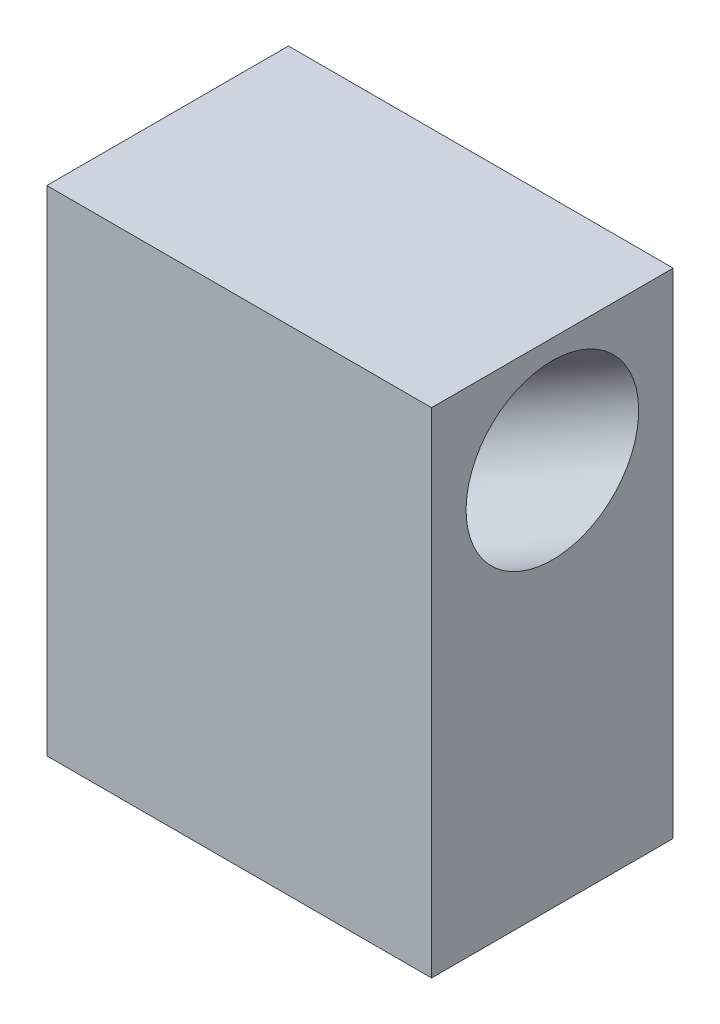
ISO-10303-21;
HEADER;
FILE_DESCRIPTION(('STEP AP214'),'2;1');
FILE_NAME('part.step','',(''),(''),'','','');
FILE_SCHEMA(('AUTOMOTIVE_DESIGN { 1 0 10303 214 1 1 1 1 }'));
ENDSEC;
DATA;
#1=APPLICATION_CONTEXT('core data for automotive mechanical design processes');
#2=APPLICATION_PROTOCOL_DEFINITION('international standard','automotive_design',2000,#1);
#3=PRODUCT_CONTEXT('',#1,'mechanical');
#4=PRODUCT('Part','Part','',(#3));
#5=PRODUCT_RELATED_PRODUCT_CATEGORY('part','',(#4));
#6=PRODUCT_DEFINITION_FORMATION('','',#4);
#7=PRODUCT_DEFINITION_CONTEXT('part definition',#1,'design');
#8=PRODUCT_DEFINITION('design','',#6,#7);
#9=PRODUCT_DEFINITION_SHAPE('','',#8);
#10=(LENGTH_UNIT() NAMED_UNIT(*) SI_UNIT(.MILLI.,.METRE.));
#11=(NAMED_UNIT(*) PLANE_ANGLE_UNIT() SI_UNIT($,.RADIAN.));
#12=(NAMED_UNIT(*) SI_UNIT($,.STERADIAN.) SOLID_ANGLE_UNIT());
#13=UNCERTAINTY_MEASURE_WITH_UNIT(LENGTH_MEASURE(1.E-05),#10,'distance_accuracy_value','');
#14=(GEOMETRIC_REPRESENTATION_CONTEXT(3) GLOBAL_UNCERTAINTY_ASSIGNED_CONTEXT((#13)) GLOBAL_UNIT_ASSIGNED_CONTEXT((#10,
#11,#12)) REPRESENTATION_CONTEXT('',''));
#15=CARTESIAN_POINT('',(0.,0.,0.));
#16=DIRECTION('',(0.,0.,1.));
#17=DIRECTION('',(1.,0.,0.));
#18=AXIS2_PLACEMENT_3D('',#15,#16,#17);
#19=CARTESIAN_POINT('',(0.,38.0812099293112,17.78));
#20=DIRECTION('',(1.,0.,0.));
#21=DIRECTION('',(0.,0.,-1.));
#22=AXIS2_PLACEMENT_3D('',#19,#20,#21);
#23=PLANE('',#22);
#24=CARTESIAN_POINT('',(0.,20.2863265692952,8.89));
#25=CARTESIAN_POINT('',(0.,20.2863260897579,8.69126862023859));
#26=CARTESIAN_POINT('',(0.,20.2769889766129,8.49253326947338));
#27=CARTESIAN_POINT('',(0.,20.2418661010776,8.1195227619519));
#28=CARTESIAN_POINT('',(0.,20.2180887225423,7.94505533322798));
#29=CARTESIAN_POINT('',(0.,20.156119160635,7.59862425830768));
#30=CARTESIAN_POINT('',(0.,20.1179214556568,7.42666159742627));
#31=CARTESIAN_POINT('',(0.,20.0273926884376,7.08656754330484));
#32=CARTESIAN_POINT('',(0.,19.9750668607778,6.91843475603493));
#33=CARTESIAN_POINT('',(0.,19.856615696106,6.58703423157109));
#34=CARTESIAN_POINT('',(0.,19.7904854395179,6.42376825256326));
#35=CARTESIAN_POINT('',(0.,19.6449197726799,6.10335020602728));
#36=CARTESIAN_POINT('',(0.,19.5654891306215,5.94619597222868));
#37=CARTESIAN_POINT('',(0.,19.3938237587573,5.63896943964902));
#38=CARTESIAN_POINT('',(0.,19.301584445833,5.48889970166747));
#39=CARTESIAN_POINT('',(0.,19.1049960764894,5.19699190627981));
#40=CARTESIAN_POINT('',(0.,19.0006513754242,5.05515091566477));
#41=CARTESIAN_POINT('',(0.,18.780506534387,4.78057232664983));
#42=CARTESIAN_POINT('',(0.,18.6647022968242,4.6478380134644));
#43=CARTESIAN_POINT('',(0.,18.4225134517148,4.39249174611572));
#44=CARTESIAN_POINT('',(0.,18.2961326547466,4.2698761776709));
#45=CARTESIAN_POINT('',(0.,18.0335802364329,4.03551879915482));
#46=CARTESIAN_POINT('',(0.,17.8974051176356,3.92378090724803));
#47=CARTESIAN_POINT('',(0.,17.6162956994275,3.71203896919075));
#48=CARTESIAN_POINT('',(0.,17.4713645599103,3.6120307278887));
#49=CARTESIAN_POINT('',(0.,17.1736461170773,3.42435845562458));
#50=CARTESIAN_POINT('',(0.,17.0208560130054,3.33669886763715));
#51=CARTESIAN_POINT('',(0.,16.7085793994891,3.17440139015028));
#52=CARTESIAN_POINT('',(0.,16.5490953120552,3.09975884037798));
#53=CARTESIAN_POINT('',(0.,16.2244223318891,2.96394792736694));
#54=CARTESIAN_POINT('',(0.,16.0592314123553,2.90278440936246));
#55=CARTESIAN_POINT('',(0.,15.7244005860883,2.7944077893921));
#56=CARTESIAN_POINT('',(0.,15.5547622966968,2.74718969056413));
#57=CARTESIAN_POINT('',(0.,15.2120898150925,2.66698594112672));
#58=CARTESIAN_POINT('',(0.,15.0390544260055,2.63400540434465));
#59=CARTESIAN_POINT('',(0.,14.6909040498447,2.5825389846644));
#60=CARTESIAN_POINT('',(0.,14.5157898311002,2.56404790603069));
#61=CARTESIAN_POINT('',(0.,14.1645708104071,2.54166282010777));
#62=CARTESIAN_POINT('',(0.,13.9884656755116,2.5377740538021));
#63=CARTESIAN_POINT('',(0.,13.636592275125,2.54463969373982));
#64=CARTESIAN_POINT('',(0.,13.4608239114469,2.5553888472222));
#65=CARTESIAN_POINT('',(0.,13.1107675938402,2.59143108344181));
#66=CARTESIAN_POINT('',(0.,12.9364801938397,2.61672938432492));
#67=CARTESIAN_POINT('',(0.,12.4177871006445,2.71424054583492));
#68=CARTESIAN_POINT('',(0.,12.0771790115668,2.80807723599546));
#69=CARTESIAN_POINT('',(0.,11.4163733142905,3.05078707683446));
#70=CARTESIAN_POINT('',(0.,11.0961757060919,3.19966022751293));
#71=CARTESIAN_POINT('',(0.,10.4847861121548,3.54835806793774));
#72=CARTESIAN_POINT('',(0.,10.1935941264162,3.74818275768409));
#73=CARTESIAN_POINT('',(0.,9.64831057584094,4.19326655878891));
#74=CARTESIAN_POINT('',(0.,9.39421901100433,4.43852567014738));
#75=CARTESIAN_POINT('',(0.,8.93012752402846,4.96771525734179));
#76=CARTESIAN_POINT('',(0.,8.7201276018892,5.25164573317773));
#77=CARTESIAN_POINT('',(0.,8.35001602999509,5.8503464532956));
#78=CARTESIAN_POINT('',(0.,8.18990438024024,6.16511669757754));
#79=CARTESIAN_POINT('',(0.,7.92398423202495,6.81681527305533));
#80=CARTESIAN_POINT('',(0.,7.8181757335645,7.15374360425119));
#81=CARTESIAN_POINT('',(0.,7.66378055478155,7.84046538324557));
#82=CARTESIAN_POINT('',(0.,7.61519387445905,8.19025883104409));
#83=CARTESIAN_POINT('',(0.,7.57658233741491,8.89306307293928));
#84=CARTESIAN_POINT('',(0.,7.58655748069327,9.24607386703595));
#85=CARTESIAN_POINT('',(0.,7.66479446277027,9.94557628150946));
#86=CARTESIAN_POINT('',(0.,7.7330563015689,10.2920679018863));
#87=CARTESIAN_POINT('',(0.,7.92598400195642,10.9689752629039));
#88=CARTESIAN_POINT('',(0.,8.0506498635453,11.2993910035447));
#89=CARTESIAN_POINT('',(0.,8.35294682984507,11.9350332792569));
#90=CARTESIAN_POINT('',(0.,8.53057793455597,12.2402598143283));
#91=CARTESIAN_POINT('',(0.,8.93390730205747,12.8171051568859));
#92=CARTESIAN_POINT('',(0.,9.15960556484808,13.0887239643721));
#93=CARTESIAN_POINT('',(0.,9.65283962148778,13.5908620856587));
#94=CARTESIAN_POINT('',(0.,9.92037541533687,13.8213813994591));
#95=CARTESIAN_POINT('',(0.,10.4899225610873,14.234963059233));
#96=CARTESIAN_POINT('',(0.,10.7919339129887,14.4180254052065));
#97=CARTESIAN_POINT('',(0.,11.4220387438292,14.7316419252481));
#98=CARTESIAN_POINT('',(0.,11.7501322227684,14.8621960993161));
#99=CARTESIAN_POINT('',(0.,12.4235892074182,15.0672032363122));
#100=CARTESIAN_POINT('',(0.,12.7689527131288,15.1416561992403));
#101=CARTESIAN_POINT('',(0.,13.2923245521952,15.2097213857871));
#102=CARTESIAN_POINT('',(0.,13.4677624296514,15.2251373833269));
#103=CARTESIAN_POINT('',(0.,13.8192954593092,15.2413545762941));
#104=CARTESIAN_POINT('',(0.,13.9953903531329,15.242161012821));
#105=CARTESIAN_POINT('',(0.,14.3470899761039,15.2291455561119));
#106=CARTESIAN_POINT('',(0.,14.5226945066605,15.2153184129522));
#107=CARTESIAN_POINT('',(0.,14.8720890180678,15.1731358577104));
#108=CARTESIAN_POINT('',(0.,15.0458796272904,15.1447856594476));
#109=CARTESIAN_POINT('',(0.,15.3905681801868,15.0737414599882));
#110=CARTESIAN_POINT('',(0.,15.5614650633565,15.0310423147342));
#111=CARTESIAN_POINT('',(0.,15.8990616778702,14.9316159754686));
#112=CARTESIAN_POINT('',(0.,16.0657628929542,14.8748938195371));
#113=CARTESIAN_POINT('',(0.,16.393939454856,14.7477823795428));
#114=CARTESIAN_POINT('',(0.,16.5554129047433,14.6773881979248));
#115=CARTESIAN_POINT('',(0.,16.871898626361,14.5234598505568));
#116=CARTESIAN_POINT('',(0.,17.0269131952648,14.4399304078516));
#117=CARTESIAN_POINT('',(0.,17.3295266454415,14.2602577775882));
#118=CARTESIAN_POINT('',(0.,17.4771228454311,14.1641100740071));
#119=CARTESIAN_POINT('',(0.,17.7637684514427,13.9599252336876));
#120=CARTESIAN_POINT('',(0.,17.9028209045888,13.8518923745978));
#121=CARTESIAN_POINT('',(0.,18.1715247794558,13.6246141815686));
#122=CARTESIAN_POINT('',(0.,18.3011728099478,13.5053648382224));
#123=CARTESIAN_POINT('',(0.,18.5500722148818,13.2565552095373));
#124=CARTESIAN_POINT('',(0.,18.6693273013833,13.1269986375319));
#125=CARTESIAN_POINT('',(0.,18.8967103223822,12.8583835733341));
#126=CARTESIAN_POINT('',(0.,19.0048342578994,12.7193216959114));
#127=CARTESIAN_POINT('',(0.,19.2091224534343,12.4327499545838));
#128=CARTESIAN_POINT('',(0.,19.3052909707873,12.2852431254207));
#129=CARTESIAN_POINT('',(0.,19.4850804469869,11.982701663116));
#130=CARTESIAN_POINT('',(0.,19.5686971181837,11.8276644814706));
#131=CARTESIAN_POINT('',(0.,19.7227393947825,11.5112370512289));
#132=CARTESIAN_POINT('',(0.,19.7931692689627,11.3498488790949));
#133=CARTESIAN_POINT('',(0.,19.9263413783141,11.0064199908309));
#134=CARTESIAN_POINT('',(0.,19.9877481016591,10.8238596155589));
#135=CARTESIAN_POINT('',(0.,20.0937156656321,10.4539887278019));
#136=CARTESIAN_POINT('',(0.,20.1382822472456,10.2666798574095));
#137=CARTESIAN_POINT('',(0.,20.2115126826327,9.88207065550815));
#138=CARTESIAN_POINT('',(0.,20.2395555852954,9.68465172466134));
#139=CARTESIAN_POINT('',(0.,20.2769581140539,9.28815594031204));
#140=CARTESIAN_POINT('',(0.,20.2863270496737,9.08907996262933));
#141=CARTESIAN_POINT('',(0.,20.2863265692952,8.89));
#142=B_SPLINE_CURVE_WITH_KNOTS('',3,(#24,#25,#26,#27,#28,#29,#30,#31,#32,#33,#34,#35,#36,#37,
#38,#39,#40,#41,#42,#43,#44,#45,#46,#47,#48,#49,#50,#51,#52,#53,#54,#55,#56,#57,#58,#59,#60,#61,
#62,#63,#64,#65,#66,#67,#68,#69,#70,#71,#72,#73,#74,#75,#76,#77,#78,#79,#80,#81,#82,#83,#84,#85,
#86,#87,#88,#89,#90,#91,#92,#93,#94,#95,#96,#97,#98,#99,#100,#101,#102,#103,#104,#105,#106,#107,
#108,#109,#110,#111,#112,#113,#114,#115,#116,#117,#118,#119,#120,#121,#122,#123,#124,#125,#126,
#127,#128,#129,#130,#131,#132,#133,#134,#135,#136,#137,#138,#139,#140,#141),.UNSPECIFIED.,.T.,
.F.,(4,2,2,2,2,2,2,2,2,2,2,2,2,2,2,2,2,2,2,2,2,2,2,2,2,2,2,2,2,2,2,2,2,2,2,2,2,2,2,2,2,2,2,2,2,
2,2,2,2,2,2,2,2,2,2,2,2,2,4),(0.,0.595969057834751,1.123616245734,1.65146567731277,
2.17911980423887,2.70696229679523,3.23461596125143,3.76245891627745,4.29011254612467,
4.81795553575968,5.34560916338672,5.87345215524192,6.40110578273356,6.92894877472415,
7.45660240220803,7.98444539420634,8.51209902168977,9.03994201368848,9.56759564117186,
10.0954386331706,10.623092260654,11.1509352526527,12.2055201537646,13.2601050548765,
14.3146899559883,15.3692748571002,16.4238597582121,17.4784446593239,18.5330295604358,
19.5876144615477,20.6421993626595,21.6967842637714,22.7513691648833,23.8059540659951,
24.860538967107,25.9151238682189,26.9697087693307,28.0242936704426,29.0788785715545,
29.6067215635532,30.1343751910366,30.662218183035,31.1898718105187,31.7177148025115,
32.2453684300009,32.7732114218938,33.3008650494831,33.8287080397384,34.3563616689653,
34.8842046335159,35.4118582884476,35.9397008516555,36.4673549079301,36.995188800103,
37.5228515274176,38.0998760643383,38.6767037095294,39.274015973521,39.8710303851575),.UNSPECIFIED.);
#143=CARTESIAN_POINT('',(0.,20.2863265692952,8.89));
#144=VERTEX_POINT('',#143);
#145=EDGE_CURVE('E110',#144,#144,#142,.T.);
#146=ORIENTED_EDGE('',*,*,#145,.F.);
#147=EDGE_LOOP('',(#146));
#148=FACE_BOUND('',#147,.T.);
#149=DIRECTION('',(0.,-1.,0.));
#150=VECTOR('',#149,1.);
#151=CARTESIAN_POINT('',(0.,38.0812099293112,0.));
#152=LINE('',#151,#150);
#153=CARTESIAN_POINT('',(0.,38.0812099293112,0.));
#154=VERTEX_POINT('',#153);
#155=CARTESIAN_POINT('',(0.,1.73703764589841,0.));
#156=VERTEX_POINT('',#155);
#157=EDGE_CURVE('E107',#154,#156,#152,.T.);
#158=ORIENTED_EDGE('',*,*,#157,.T.);
#159=DIRECTION('',(0.,0.,-1.));
#160=VECTOR('',#159,1.);
#161=CARTESIAN_POINT('',(0.,1.73703764589841,17.78));
#162=LINE('',#161,#160);
#163=CARTESIAN_POINT('',(0.,1.73703764589841,17.78));
#164=VERTEX_POINT('',#163);
#165=EDGE_CURVE('E11',#164,#156,#162,.T.);
#166=ORIENTED_EDGE('',*,*,#165,.F.);
#167=DIRECTION('',(0.,-1.,0.));
#168=VECTOR('',#167,1.);
#169=CARTESIAN_POINT('',(0.,38.0812099293112,17.78));
#170=LINE('',#169,#168);
#171=CARTESIAN_POINT('',(0.,38.0812099293112,17.78));
#172=VERTEX_POINT('',#171);
#173=EDGE_CURVE('E89',#172,#164,#170,.T.);
#174=ORIENTED_EDGE('',*,*,#173,.F.);
#175=DIRECTION('',(0.,0.,-1.));
#176=VECTOR('',#175,1.);
#177=CARTESIAN_POINT('',(0.,38.0812099293112,17.78));
#178=LINE('',#177,#176);
#179=EDGE_CURVE('E56',#172,#154,#178,.T.);
#180=ORIENTED_EDGE('',*,*,#179,.T.);
#181=EDGE_LOOP('',(#158,#166,#174,#180));
#182=FACE_BOUND('',#181,.T.);
#183=ADVANCED_FACE('F39',(#148,#182),#23,.F.);
#184=CARTESIAN_POINT('',(0.,1.73703764589841,17.78));
#185=DIRECTION('',(0.,1.,0.));
#186=DIRECTION('',(-1.,0.,0.));
#187=AXIS2_PLACEMENT_3D('',#184,#185,#186);
#188=PLANE('',#187);
#189=DIRECTION('',(1.,0.,0.));
#190=VECTOR('',#189,1.);
#191=CARTESIAN_POINT('',(0.,1.73703764589841,0.));
#192=LINE('',#191,#190);
#193=CARTESIAN_POINT('',(28.3096509820903,1.73703764589842,0.));
#194=VERTEX_POINT('',#193);
#195=EDGE_CURVE('E95',#156,#194,#192,.T.);
#196=ORIENTED_EDGE('',*,*,#195,.T.);
#197=DIRECTION('',(0.,0.,-1.));
#198=VECTOR('',#197,1.);
#199=CARTESIAN_POINT('',(28.3096509820903,1.73703764589842,17.78));
#200=LINE('',#199,#198);
#201=CARTESIAN_POINT('',(28.3096509820903,1.73703764589842,17.78));
#202=VERTEX_POINT('',#201);
#203=EDGE_CURVE('E48',#202,#194,#200,.T.);
#204=ORIENTED_EDGE('',*,*,#203,.F.);
#205=DIRECTION('',(1.,0.,0.));
#206=VECTOR('',#205,1.);
#207=CARTESIAN_POINT('',(0.,1.73703764589841,17.78));
#208=LINE('',#207,#206);
#209=EDGE_CURVE('E81',#164,#202,#208,.T.);
#210=ORIENTED_EDGE('',*,*,#209,.F.);
#211=ORIENTED_EDGE('',*,*,#165,.T.);
#212=EDGE_LOOP('',(#196,#204,#210,#211));
#213=FACE_BOUND('',#212,.T.);
#214=ADVANCED_FACE('F94',(#213),#188,.F.);
#215=CARTESIAN_POINT('',(28.3096509820903,38.0812099293112,17.78));
#216=DIRECTION('',(1.,0.,0.));
#217=DIRECTION('',(0.,1.,0.));
#218=AXIS2_PLACEMENT_3D('',#215,#216,#217);
#219=PLANE('',#218);
#220=CARTESIAN_POINT('',(28.3096509820903,30.2809111844695,8.89));
#221=DIRECTION('',(1.,0.,0.));
#222=DIRECTION('',(0.,1.,0.));
#223=AXIS2_PLACEMENT_3D('',#220,#221,#222);
#224=CIRCLE('',#223,6.35);
#225=CARTESIAN_POINT('',(28.3096509820903,36.6309111844695,8.89));
#226=VERTEX_POINT('',#225);
#227=EDGE_CURVE('E134',#226,#226,#224,.T.);
#228=ORIENTED_EDGE('',*,*,#227,.F.);
#229=EDGE_LOOP('',(#228));
#230=FACE_BOUND('',#229,.T.);
#231=DIRECTION('',(0.,-1.,0.));
#232=VECTOR('',#231,1.);
#233=CARTESIAN_POINT('',(28.3096509820903,38.0812099293112,0.));
#234=LINE('',#233,#232);
#235=CARTESIAN_POINT('',(28.3096509820903,38.0812099293112,0.));
#236=VERTEX_POINT('',#235);
#237=EDGE_CURVE('E113',#236,#194,#234,.T.);
#238=ORIENTED_EDGE('',*,*,#237,.F.);
#239=DIRECTION('',(0.,0.,-1.));
#240=VECTOR('',#239,1.);
#241=CARTESIAN_POINT('',(28.3096509820903,38.0812099293112,17.78));
#242=LINE('',#241,#240);
#243=CARTESIAN_POINT('',(28.3096509820903,38.0812099293112,17.78));
#244=VERTEX_POINT('',#243);
#245=EDGE_CURVE('E70',#244,#236,#242,.T.);
#246=ORIENTED_EDGE('',*,*,#245,.F.);
#247=DIRECTION('',(0.,-1.,0.));
#248=VECTOR('',#247,1.);
#249=CARTESIAN_POINT('',(28.3096509820903,38.0812099293112,17.78));
#250=LINE('',#249,#248);
#251=EDGE_CURVE('E88',#244,#202,#250,.T.);
#252=ORIENTED_EDGE('',*,*,#251,.T.);
#253=ORIENTED_EDGE('',*,*,#203,.T.);
#254=EDGE_LOOP('',(#238,#246,#252,#253));
#255=FACE_BOUND('',#254,.T.);
#256=ADVANCED_FACE('F99',(#230,#255),#219,.T.);
#257=CARTESIAN_POINT('',(0.,38.0812099293112,17.78));
#258=DIRECTION('',(0.,1.,0.));
#259=DIRECTION('',(0.,0.,1.));
#260=AXIS2_PLACEMENT_3D('',#257,#258,#259);
#261=PLANE('',#260);
#262=DIRECTION('',(1.,0.,0.));
#263=VECTOR('',#262,1.);
#264=CARTESIAN_POINT('',(0.,38.0812099293112,0.));
#265=LINE('',#264,#263);
#266=EDGE_CURVE('E116',#154,#236,#265,.T.);
#267=ORIENTED_EDGE('',*,*,#266,.F.);
#268=ORIENTED_EDGE('',*,*,#179,.F.);
#269=DIRECTION('',(1.,0.,0.));
#270=VECTOR('',#269,1.);
#271=CARTESIAN_POINT('',(0.,38.0812099293112,17.78));
#272=LINE('',#271,#270);
#273=EDGE_CURVE('E101',#172,#244,#272,.T.);
#274=ORIENTED_EDGE('',*,*,#273,.T.);
#275=ORIENTED_EDGE('',*,*,#245,.T.);
#276=EDGE_LOOP('',(#267,#268,#274,#275));
#277=FACE_BOUND('',#276,.T.);
#278=ADVANCED_FACE('F146',(#277),#261,.T.);
#279=CARTESIAN_POINT('',(0.,0.,17.78));
#280=DIRECTION('',(0.,0.,1.));
#281=DIRECTION('',(1.,0.,0.));
#282=AXIS2_PLACEMENT_3D('',#279,#280,#281);
#283=PLANE('',#282);
#284=ORIENTED_EDGE('',*,*,#173,.T.);
#285=ORIENTED_EDGE('',*,*,#209,.T.);
#286=ORIENTED_EDGE('',*,*,#251,.F.);
#287=ORIENTED_EDGE('',*,*,#273,.F.);
#288=EDGE_LOOP('',(#284,#285,#286,#287));
#289=FACE_BOUND('',#288,.T.);
#290=ADVANCED_FACE('F85',(#289),#283,.T.);
#291=CARTESIAN_POINT('',(0.,0.,0.));
#292=DIRECTION('',(0.,0.,1.));
#293=DIRECTION('',(1.,0.,0.));
#294=AXIS2_PLACEMENT_3D('',#291,#292,#293);
#295=PLANE('',#294);
#296=ORIENTED_EDGE('',*,*,#157,.F.);
#297=ORIENTED_EDGE('',*,*,#266,.T.);
#298=ORIENTED_EDGE('',*,*,#237,.T.);
#299=ORIENTED_EDGE('',*,*,#195,.F.);
#300=EDGE_LOOP('',(#296,#297,#298,#299));
#301=FACE_BOUND('',#300,.T.);
#302=ADVANCED_FACE('F141',(#301),#295,.F.);
#303=CARTESIAN_POINT('',(-16.7573860544057,4.26144521986956,8.89));
#304=DIRECTION('',(1.,0.,0.));
#305=DIRECTION('',(0.,1.,0.));
#306=AXIS2_PLACEMENT_3D('',#303,#304,#305);
#307=CIRCLE('',#306,6.35);
#308=DIRECTION('',(0.866025403784438,0.500000000000001,0.));
#309=VECTOR('',#308,1.);
#310=SURFACE_OF_LINEAR_EXTRUSION('',#307,#309);
#311=ORIENTED_EDGE('',*,*,#145,.T.);
#312=EDGE_LOOP('',(#311));
#313=FACE_BOUND('',#312,.T.);
#314=ORIENTED_EDGE('',*,*,#227,.T.);
#315=EDGE_LOOP('',(#314));
#316=FACE_BOUND('',#315,.T.);
#317=ADVANCED_FACE('F136',(#313,#316),#310,.F.);
#318=CLOSED_SHELL('',(#183,#214,#256,#278,#290,#302,#317));
#319=MANIFOLD_SOLID_BREP('B2',#318);
#320=ADVANCED_BREP_SHAPE_REPRESENTATION('',(#18,#319),#14);
#321=SHAPE_DEFINITION_REPRESENTATION(#9,#320);
ENDSEC;
END-ISO-10303-21;
